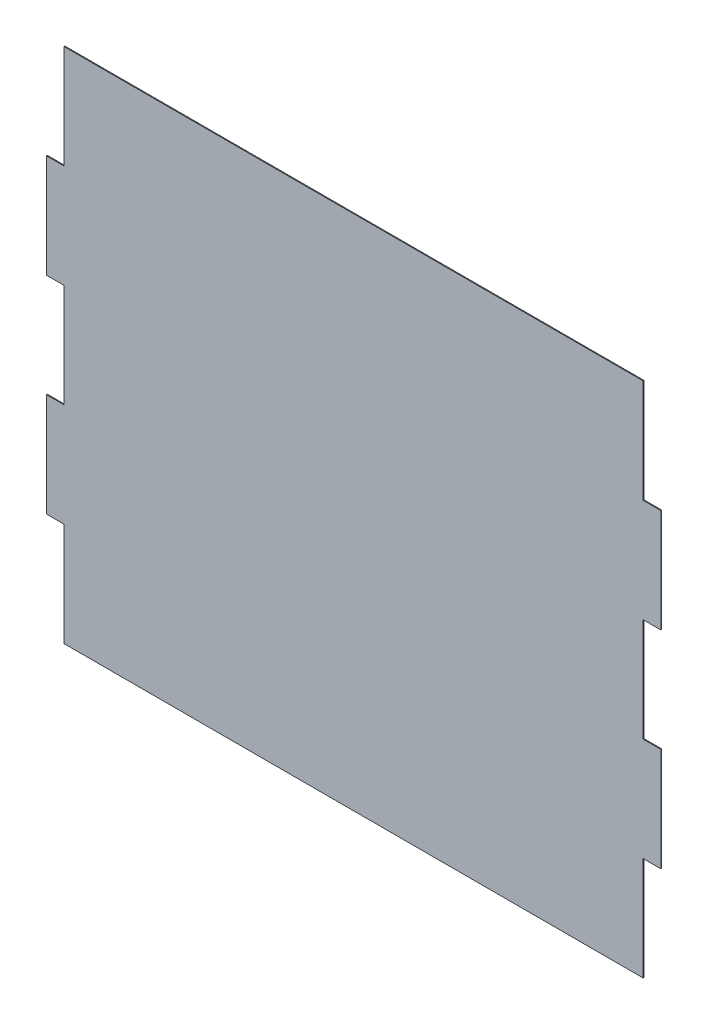
ISO-10303-21;
HEADER;
FILE_DESCRIPTION(('STEP AP214'),'2;1');
FILE_NAME('part.step','',(''),(''),'','','');
FILE_SCHEMA(('AUTOMOTIVE_DESIGN { 1 0 10303 214 1 1 1 1 }'));
ENDSEC;
DATA;
#1=APPLICATION_CONTEXT('core data for automotive mechanical design processes');
#2=APPLICATION_PROTOCOL_DEFINITION('international standard','automotive_design',2000,#1);
#3=PRODUCT_CONTEXT('',#1,'mechanical');
#4=PRODUCT('Part','Part','',(#3));
#5=PRODUCT_RELATED_PRODUCT_CATEGORY('part','',(#4));
#6=PRODUCT_DEFINITION_FORMATION('','',#4);
#7=PRODUCT_DEFINITION_CONTEXT('part definition',#1,'design');
#8=PRODUCT_DEFINITION('design','',#6,#7);
#9=PRODUCT_DEFINITION_SHAPE('','',#8);
#10=(LENGTH_UNIT() NAMED_UNIT(*) SI_UNIT(.MILLI.,.METRE.));
#11=(NAMED_UNIT(*) PLANE_ANGLE_UNIT() SI_UNIT($,.RADIAN.));
#12=(NAMED_UNIT(*) SI_UNIT($,.STERADIAN.) SOLID_ANGLE_UNIT());
#13=UNCERTAINTY_MEASURE_WITH_UNIT(LENGTH_MEASURE(1.E-05),#10,'distance_accuracy_value','');
#14=(GEOMETRIC_REPRESENTATION_CONTEXT(3) GLOBAL_UNCERTAINTY_ASSIGNED_CONTEXT((#13)) GLOBAL_UNIT_ASSIGNED_CONTEXT((#10,
#11,#12)) REPRESENTATION_CONTEXT('',''));
#15=CARTESIAN_POINT('',(0.,0.,0.));
#16=DIRECTION('',(0.,0.,1.));
#17=DIRECTION('',(1.,0.,0.));
#18=AXIS2_PLACEMENT_3D('',#15,#16,#17);
#19=CARTESIAN_POINT('',(84.,45.,0.125));
#20=DIRECTION('',(-1.,0.,0.));
#21=DIRECTION('',(0.,0.,1.));
#22=AXIS2_PLACEMENT_3D('',#19,#20,#21);
#23=PLANE('',#22);
#24=DIRECTION('',(0.,1.,0.));
#25=VECTOR('',#24,1.);
#26=CARTESIAN_POINT('',(84.,45.,-0.125));
#27=LINE('',#26,#25);
#28=CARTESIAN_POINT('',(84.,45.,-0.125));
#29=VERTEX_POINT('',#28);
#30=CARTESIAN_POINT('',(84.,75.,-0.125));
#31=VERTEX_POINT('',#30);
#32=EDGE_CURVE('E201',#29,#31,#27,.T.);
#33=ORIENTED_EDGE('',*,*,#32,.T.);
#34=DIRECTION('',(0.,0.,-1.));
#35=VECTOR('',#34,1.);
#36=CARTESIAN_POINT('',(84.,75.,0.125));
#37=LINE('',#36,#35);
#38=CARTESIAN_POINT('',(84.,75.,0.125));
#39=VERTEX_POINT('',#38);
#40=EDGE_CURVE('E11',#39,#31,#37,.T.);
#41=ORIENTED_EDGE('',*,*,#40,.F.);
#42=DIRECTION('',(0.,1.,0.));
#43=VECTOR('',#42,1.);
#44=CARTESIAN_POINT('',(84.,45.,0.125));
#45=LINE('',#44,#43);
#46=CARTESIAN_POINT('',(84.,45.,0.125));
#47=VERTEX_POINT('',#46);
#48=EDGE_CURVE('E252',#47,#39,#45,.T.);
#49=ORIENTED_EDGE('',*,*,#48,.F.);
#50=DIRECTION('',(0.,0.,-1.));
#51=VECTOR('',#50,1.);
#52=CARTESIAN_POINT('',(84.,45.,0.125));
#53=LINE('',#52,#51);
#54=EDGE_CURVE('E49',#47,#29,#53,.T.);
#55=ORIENTED_EDGE('',*,*,#54,.T.);
#56=EDGE_LOOP('',(#33,#41,#49,#55));
#57=FACE_BOUND('',#56,.T.);
#58=ADVANCED_FACE('F33',(#57),#23,.F.);
#59=CARTESIAN_POINT('',(84.,75.,0.125));
#60=DIRECTION('',(0.,-1.,0.));
#61=DIRECTION('',(0.,0.,-1.));
#62=AXIS2_PLACEMENT_3D('',#59,#60,#61);
#63=PLANE('',#62);
#64=DIRECTION('',(-1.,0.,0.));
#65=VECTOR('',#64,1.);
#66=CARTESIAN_POINT('',(84.,75.,-0.125));
#67=LINE('',#66,#65);
#68=CARTESIAN_POINT('',(-84.,75.,-0.125));
#69=VERTEX_POINT('',#68);
#70=EDGE_CURVE('E203',#31,#69,#67,.T.);
#71=ORIENTED_EDGE('',*,*,#70,.T.);
#72=DIRECTION('',(0.,0.,-1.));
#73=VECTOR('',#72,1.);
#74=CARTESIAN_POINT('',(-84.,75.,0.125));
#75=LINE('',#74,#73);
#76=CARTESIAN_POINT('',(-84.,75.,0.125));
#77=VERTEX_POINT('',#76);
#78=EDGE_CURVE('E41',#77,#69,#75,.T.);
#79=ORIENTED_EDGE('',*,*,#78,.F.);
#80=DIRECTION('',(-1.,0.,0.));
#81=VECTOR('',#80,1.);
#82=CARTESIAN_POINT('',(84.,75.,0.125));
#83=LINE('',#82,#81);
#84=EDGE_CURVE('E123',#39,#77,#83,.T.);
#85=ORIENTED_EDGE('',*,*,#84,.F.);
#86=ORIENTED_EDGE('',*,*,#40,.T.);
#87=EDGE_LOOP('',(#71,#79,#85,#86));
#88=FACE_BOUND('',#87,.T.);
#89=ADVANCED_FACE('F294',(#88),#63,.F.);
#90=CARTESIAN_POINT('',(-84.,45.,0.125));
#91=DIRECTION('',(-1.,0.,0.));
#92=DIRECTION('',(0.,0.,1.));
#93=AXIS2_PLACEMENT_3D('',#90,#91,#92);
#94=PLANE('',#93);
#95=DIRECTION('',(0.,1.,0.));
#96=VECTOR('',#95,1.);
#97=CARTESIAN_POINT('',(-84.,45.,-0.125));
#98=LINE('',#97,#96);
#99=CARTESIAN_POINT('',(-84.,45.,-0.125));
#100=VERTEX_POINT('',#99);
#101=EDGE_CURVE('E206',#100,#69,#98,.T.);
#102=ORIENTED_EDGE('',*,*,#101,.F.);
#103=DIRECTION('',(0.,0.,-1.));
#104=VECTOR('',#103,1.);
#105=CARTESIAN_POINT('',(-84.,45.,0.125));
#106=LINE('',#105,#104);
#107=CARTESIAN_POINT('',(-84.,45.,0.125));
#108=VERTEX_POINT('',#107);
#109=EDGE_CURVE('E287',#108,#100,#106,.T.);
#110=ORIENTED_EDGE('',*,*,#109,.F.);
#111=DIRECTION('',(0.,1.,0.));
#112=VECTOR('',#111,1.);
#113=CARTESIAN_POINT('',(-84.,45.,0.125));
#114=LINE('',#113,#112);
#115=EDGE_CURVE('E293',#108,#77,#114,.T.);
#116=ORIENTED_EDGE('',*,*,#115,.T.);
#117=ORIENTED_EDGE('',*,*,#78,.T.);
#118=EDGE_LOOP('',(#102,#110,#116,#117));
#119=FACE_BOUND('',#118,.T.);
#120=ADVANCED_FACE('F291',(#119),#94,.T.);
#121=CARTESIAN_POINT('',(-84.,45.,0.125));
#122=DIRECTION('',(0.,-1.,0.));
#123=DIRECTION('',(0.,0.,-1.));
#124=AXIS2_PLACEMENT_3D('',#121,#122,#123);
#125=PLANE('',#124);
#126=DIRECTION('',(-1.,0.,0.));
#127=VECTOR('',#126,1.);
#128=CARTESIAN_POINT('',(-84.,45.,-0.125));
#129=LINE('',#128,#127);
#130=CARTESIAN_POINT('',(-89.1239442731817,45.,-0.125));
#131=VERTEX_POINT('',#130);
#132=EDGE_CURVE('E209',#100,#131,#129,.T.);
#133=ORIENTED_EDGE('',*,*,#132,.T.);
#134=DIRECTION('',(0.,0.,-1.));
#135=VECTOR('',#134,1.);
#136=CARTESIAN_POINT('',(-89.1239442731817,45.,0.125));
#137=LINE('',#136,#135);
#138=CARTESIAN_POINT('',(-89.1239442731817,45.,0.125));
#139=VERTEX_POINT('',#138);
#140=EDGE_CURVE('E284',#139,#131,#137,.T.);
#141=ORIENTED_EDGE('',*,*,#140,.F.);
#142=DIRECTION('',(-1.,0.,0.));
#143=VECTOR('',#142,1.);
#144=CARTESIAN_POINT('',(-84.,45.,0.125));
#145=LINE('',#144,#143);
#146=EDGE_CURVE('E312',#108,#139,#145,.T.);
#147=ORIENTED_EDGE('',*,*,#146,.F.);
#148=ORIENTED_EDGE('',*,*,#109,.T.);
#149=EDGE_LOOP('',(#133,#141,#147,#148));
#150=FACE_BOUND('',#149,.T.);
#151=ADVANCED_FACE('F303',(#150),#125,.F.);
#152=CARTESIAN_POINT('',(-89.1239442731817,45.,0.125));
#153=DIRECTION('',(1.,0.,0.));
#154=DIRECTION('',(0.,0.,-1.));
#155=AXIS2_PLACEMENT_3D('',#152,#153,#154);
#156=PLANE('',#155);
#157=DIRECTION('',(0.,-1.,0.));
#158=VECTOR('',#157,1.);
#159=CARTESIAN_POINT('',(-89.1239442731817,45.,-0.125));
#160=LINE('',#159,#158);
#161=CARTESIAN_POINT('',(-89.1239442731817,15.,-0.125));
#162=VERTEX_POINT('',#161);
#163=EDGE_CURVE('E211',#131,#162,#160,.T.);
#164=ORIENTED_EDGE('',*,*,#163,.T.);
#165=DIRECTION('',(0.,0.,-1.));
#166=VECTOR('',#165,1.);
#167=CARTESIAN_POINT('',(-89.1239442731817,15.,0.125));
#168=LINE('',#167,#166);
#169=CARTESIAN_POINT('',(-89.1239442731817,15.,0.125));
#170=VERTEX_POINT('',#169);
#171=EDGE_CURVE('E281',#170,#162,#168,.T.);
#172=ORIENTED_EDGE('',*,*,#171,.F.);
#173=DIRECTION('',(0.,-1.,0.));
#174=VECTOR('',#173,1.);
#175=CARTESIAN_POINT('',(-89.1239442731817,45.,0.125));
#176=LINE('',#175,#174);
#177=EDGE_CURVE('E309',#139,#170,#176,.T.);
#178=ORIENTED_EDGE('',*,*,#177,.F.);
#179=ORIENTED_EDGE('',*,*,#140,.T.);
#180=EDGE_LOOP('',(#164,#172,#178,#179));
#181=FACE_BOUND('',#180,.T.);
#182=ADVANCED_FACE('F307',(#181),#156,.F.);
#183=CARTESIAN_POINT('',(-89.1239442731817,15.,0.125));
#184=DIRECTION('',(0.,1.,0.));
#185=DIRECTION('',(0.,0.,1.));
#186=AXIS2_PLACEMENT_3D('',#183,#184,#185);
#187=PLANE('',#186);
#188=DIRECTION('',(1.,0.,0.));
#189=VECTOR('',#188,1.);
#190=CARTESIAN_POINT('',(-89.1239442731817,15.,-0.125));
#191=LINE('',#190,#189);
#192=CARTESIAN_POINT('',(-84.,15.,-0.125));
#193=VERTEX_POINT('',#192);
#194=EDGE_CURVE('E213',#162,#193,#191,.T.);
#195=ORIENTED_EDGE('',*,*,#194,.T.);
#196=DIRECTION('',(0.,0.,-1.));
#197=VECTOR('',#196,1.);
#198=CARTESIAN_POINT('',(-84.,15.,0.125));
#199=LINE('',#198,#197);
#200=CARTESIAN_POINT('',(-84.,15.,0.125));
#201=VERTEX_POINT('',#200);
#202=EDGE_CURVE('E279',#201,#193,#199,.T.);
#203=ORIENTED_EDGE('',*,*,#202,.F.);
#204=DIRECTION('',(1.,0.,0.));
#205=VECTOR('',#204,1.);
#206=CARTESIAN_POINT('',(-89.1239442731817,15.,0.125));
#207=LINE('',#206,#205);
#208=EDGE_CURVE('E311',#170,#201,#207,.T.);
#209=ORIENTED_EDGE('',*,*,#208,.F.);
#210=ORIENTED_EDGE('',*,*,#171,.T.);
#211=EDGE_LOOP('',(#195,#203,#209,#210));
#212=FACE_BOUND('',#211,.T.);
#213=ADVANCED_FACE('F378',(#212),#187,.F.);
#214=CARTESIAN_POINT('',(-84.,-15.,0.125));
#215=DIRECTION('',(-1.,0.,0.));
#216=DIRECTION('',(0.,0.,1.));
#217=AXIS2_PLACEMENT_3D('',#214,#215,#216);
#218=PLANE('',#217);
#219=DIRECTION('',(0.,1.,0.));
#220=VECTOR('',#219,1.);
#221=CARTESIAN_POINT('',(-84.,-15.,-0.125));
#222=LINE('',#221,#220);
#223=CARTESIAN_POINT('',(-84.,-15.,-0.125));
#224=VERTEX_POINT('',#223);
#225=EDGE_CURVE('E216',#224,#193,#222,.T.);
#226=ORIENTED_EDGE('',*,*,#225,.F.);
#227=DIRECTION('',(0.,0.,-1.));
#228=VECTOR('',#227,1.);
#229=CARTESIAN_POINT('',(-84.,-15.,0.125));
#230=LINE('',#229,#228);
#231=CARTESIAN_POINT('',(-84.,-15.,0.125));
#232=VERTEX_POINT('',#231);
#233=EDGE_CURVE('E277',#232,#224,#230,.T.);
#234=ORIENTED_EDGE('',*,*,#233,.F.);
#235=DIRECTION('',(0.,1.,0.));
#236=VECTOR('',#235,1.);
#237=CARTESIAN_POINT('',(-84.,-15.,0.125));
#238=LINE('',#237,#236);
#239=EDGE_CURVE('E314',#232,#201,#238,.T.);
#240=ORIENTED_EDGE('',*,*,#239,.T.);
#241=ORIENTED_EDGE('',*,*,#202,.T.);
#242=EDGE_LOOP('',(#226,#234,#240,#241));
#243=FACE_BOUND('',#242,.T.);
#244=ADVANCED_FACE('F381',(#243),#218,.T.);
#245=CARTESIAN_POINT('',(-89.1239442731817,-15.,0.125));
#246=DIRECTION('',(0.,1.,0.));
#247=DIRECTION('',(0.,0.,1.));
#248=AXIS2_PLACEMENT_3D('',#245,#246,#247);
#249=PLANE('',#248);
#250=DIRECTION('',(1.,0.,0.));
#251=VECTOR('',#250,1.);
#252=CARTESIAN_POINT('',(-89.1239442731817,-15.,-0.125));
#253=LINE('',#252,#251);
#254=CARTESIAN_POINT('',(-89.1239442731817,-15.,-0.125));
#255=VERTEX_POINT('',#254);
#256=EDGE_CURVE('E219',#255,#224,#253,.T.);
#257=ORIENTED_EDGE('',*,*,#256,.F.);
#258=DIRECTION('',(0.,0.,-1.));
#259=VECTOR('',#258,1.);
#260=CARTESIAN_POINT('',(-89.1239442731817,-15.,0.125));
#261=LINE('',#260,#259);
#262=CARTESIAN_POINT('',(-89.1239442731817,-15.,0.125));
#263=VERTEX_POINT('',#262);
#264=EDGE_CURVE('E275',#263,#255,#261,.T.);
#265=ORIENTED_EDGE('',*,*,#264,.F.);
#266=DIRECTION('',(1.,0.,0.));
#267=VECTOR('',#266,1.);
#268=CARTESIAN_POINT('',(-89.1239442731817,-15.,0.125));
#269=LINE('',#268,#267);
#270=EDGE_CURVE('E321',#263,#232,#269,.T.);
#271=ORIENTED_EDGE('',*,*,#270,.T.);
#272=ORIENTED_EDGE('',*,*,#233,.T.);
#273=EDGE_LOOP('',(#257,#265,#271,#272));
#274=FACE_BOUND('',#273,.T.);
#275=ADVANCED_FACE('F385',(#274),#249,.T.);
#276=CARTESIAN_POINT('',(-89.1239442731817,-45.,0.125));
#277=DIRECTION('',(-1.,0.,0.));
#278=DIRECTION('',(0.,0.,1.));
#279=AXIS2_PLACEMENT_3D('',#276,#277,#278);
#280=PLANE('',#279);
#281=DIRECTION('',(0.,1.,0.));
#282=VECTOR('',#281,1.);
#283=CARTESIAN_POINT('',(-89.1239442731817,-45.,-0.125));
#284=LINE('',#283,#282);
#285=CARTESIAN_POINT('',(-89.1239442731817,-45.,-0.125));
#286=VERTEX_POINT('',#285);
#287=EDGE_CURVE('E222',#286,#255,#284,.T.);
#288=ORIENTED_EDGE('',*,*,#287,.F.);
#289=DIRECTION('',(0.,0.,-1.));
#290=VECTOR('',#289,1.);
#291=CARTESIAN_POINT('',(-89.1239442731817,-45.,0.125));
#292=LINE('',#291,#290);
#293=CARTESIAN_POINT('',(-89.1239442731817,-45.,0.125));
#294=VERTEX_POINT('',#293);
#295=EDGE_CURVE('E273',#294,#286,#292,.T.);
#296=ORIENTED_EDGE('',*,*,#295,.F.);
#297=DIRECTION('',(0.,1.,0.));
#298=VECTOR('',#297,1.);
#299=CARTESIAN_POINT('',(-89.1239442731817,-45.,0.125));
#300=LINE('',#299,#298);
#301=EDGE_CURVE('E324',#294,#263,#300,.T.);
#302=ORIENTED_EDGE('',*,*,#301,.T.);
#303=ORIENTED_EDGE('',*,*,#264,.T.);
#304=EDGE_LOOP('',(#288,#296,#302,#303));
#305=FACE_BOUND('',#304,.T.);
#306=ADVANCED_FACE('F389',(#305),#280,.T.);
#307=CARTESIAN_POINT('',(-84.,-45.,0.125));
#308=DIRECTION('',(0.,-1.,0.));
#309=DIRECTION('',(0.,0.,-1.));
#310=AXIS2_PLACEMENT_3D('',#307,#308,#309);
#311=PLANE('',#310);
#312=DIRECTION('',(-1.,0.,0.));
#313=VECTOR('',#312,1.);
#314=CARTESIAN_POINT('',(-84.,-45.,-0.125));
#315=LINE('',#314,#313);
#316=CARTESIAN_POINT('',(-84.,-45.,-0.125));
#317=VERTEX_POINT('',#316);
#318=EDGE_CURVE('E225',#317,#286,#315,.T.);
#319=ORIENTED_EDGE('',*,*,#318,.F.);
#320=DIRECTION('',(0.,0.,-1.));
#321=VECTOR('',#320,1.);
#322=CARTESIAN_POINT('',(-84.,-45.,0.125));
#323=LINE('',#322,#321);
#324=CARTESIAN_POINT('',(-84.,-45.,0.125));
#325=VERTEX_POINT('',#324);
#326=EDGE_CURVE('E271',#325,#317,#323,.T.);
#327=ORIENTED_EDGE('',*,*,#326,.F.);
#328=DIRECTION('',(-1.,0.,0.));
#329=VECTOR('',#328,1.);
#330=CARTESIAN_POINT('',(-84.,-45.,0.125));
#331=LINE('',#330,#329);
#332=EDGE_CURVE('E327',#325,#294,#331,.T.);
#333=ORIENTED_EDGE('',*,*,#332,.T.);
#334=ORIENTED_EDGE('',*,*,#295,.T.);
#335=EDGE_LOOP('',(#319,#327,#333,#334));
#336=FACE_BOUND('',#335,.T.);
#337=ADVANCED_FACE('F393',(#336),#311,.T.);
#338=CARTESIAN_POINT('',(-84.,-45.,0.125));
#339=DIRECTION('',(1.,0.,0.));
#340=DIRECTION('',(0.,0.,-1.));
#341=AXIS2_PLACEMENT_3D('',#338,#339,#340);
#342=PLANE('',#341);
#343=DIRECTION('',(0.,-1.,0.));
#344=VECTOR('',#343,1.);
#345=CARTESIAN_POINT('',(-84.,-45.,-0.125));
#346=LINE('',#345,#344);
#347=CARTESIAN_POINT('',(-84.,-75.,-0.125));
#348=VERTEX_POINT('',#347);
#349=EDGE_CURVE('E228',#317,#348,#346,.T.);
#350=ORIENTED_EDGE('',*,*,#349,.T.);
#351=DIRECTION('',(0.,0.,-1.));
#352=VECTOR('',#351,1.);
#353=CARTESIAN_POINT('',(-84.,-75.,0.125));
#354=LINE('',#353,#352);
#355=CARTESIAN_POINT('',(-84.,-75.,0.125));
#356=VERTEX_POINT('',#355);
#357=EDGE_CURVE('E269',#356,#348,#354,.T.);
#358=ORIENTED_EDGE('',*,*,#357,.F.);
#359=DIRECTION('',(0.,-1.,0.));
#360=VECTOR('',#359,1.);
#361=CARTESIAN_POINT('',(-84.,-45.,0.125));
#362=LINE('',#361,#360);
#363=EDGE_CURVE('E330',#325,#356,#362,.T.);
#364=ORIENTED_EDGE('',*,*,#363,.F.);
#365=ORIENTED_EDGE('',*,*,#326,.T.);
#366=EDGE_LOOP('',(#350,#358,#364,#365));
#367=FACE_BOUND('',#366,.T.);
#368=ADVANCED_FACE('F397',(#367),#342,.F.);
#369=CARTESIAN_POINT('',(84.,-75.,0.125));
#370=DIRECTION('',(0.,-1.,0.));
#371=DIRECTION('',(0.,0.,-1.));
#372=AXIS2_PLACEMENT_3D('',#369,#370,#371);
#373=PLANE('',#372);
#374=DIRECTION('',(-1.,0.,0.));
#375=VECTOR('',#374,1.);
#376=CARTESIAN_POINT('',(84.,-75.,-0.125));
#377=LINE('',#376,#375);
#378=CARTESIAN_POINT('',(84.,-75.,-0.125));
#379=VERTEX_POINT('',#378);
#380=EDGE_CURVE('E231',#379,#348,#377,.T.);
#381=ORIENTED_EDGE('',*,*,#380,.F.);
#382=DIRECTION('',(0.,0.,-1.));
#383=VECTOR('',#382,1.);
#384=CARTESIAN_POINT('',(84.,-75.,0.125));
#385=LINE('',#384,#383);
#386=CARTESIAN_POINT('',(84.,-75.,0.125));
#387=VERTEX_POINT('',#386);
#388=EDGE_CURVE('E267',#387,#379,#385,.T.);
#389=ORIENTED_EDGE('',*,*,#388,.F.);
#390=DIRECTION('',(-1.,0.,0.));
#391=VECTOR('',#390,1.);
#392=CARTESIAN_POINT('',(84.,-75.,0.125));
#393=LINE('',#392,#391);
#394=EDGE_CURVE('E332',#387,#356,#393,.T.);
#395=ORIENTED_EDGE('',*,*,#394,.T.);
#396=ORIENTED_EDGE('',*,*,#357,.T.);
#397=EDGE_LOOP('',(#381,#389,#395,#396));
#398=FACE_BOUND('',#397,.T.);
#399=ADVANCED_FACE('F401',(#398),#373,.T.);
#400=CARTESIAN_POINT('',(84.,-45.,0.125));
#401=DIRECTION('',(1.,0.,0.));
#402=DIRECTION('',(0.,0.,-1.));
#403=AXIS2_PLACEMENT_3D('',#400,#401,#402);
#404=PLANE('',#403);
#405=DIRECTION('',(0.,-1.,0.));
#406=VECTOR('',#405,1.);
#407=CARTESIAN_POINT('',(84.,-45.,-0.125));
#408=LINE('',#407,#406);
#409=CARTESIAN_POINT('',(84.,-45.,-0.125));
#410=VERTEX_POINT('',#409);
#411=EDGE_CURVE('E234',#410,#379,#408,.T.);
#412=ORIENTED_EDGE('',*,*,#411,.F.);
#413=DIRECTION('',(0.,0.,-1.));
#414=VECTOR('',#413,1.);
#415=CARTESIAN_POINT('',(84.,-45.,0.125));
#416=LINE('',#415,#414);
#417=CARTESIAN_POINT('',(84.,-45.,0.125));
#418=VERTEX_POINT('',#417);
#419=EDGE_CURVE('E265',#418,#410,#416,.T.);
#420=ORIENTED_EDGE('',*,*,#419,.F.);
#421=DIRECTION('',(0.,-1.,0.));
#422=VECTOR('',#421,1.);
#423=CARTESIAN_POINT('',(84.,-45.,0.125));
#424=LINE('',#423,#422);
#425=EDGE_CURVE('E335',#418,#387,#424,.T.);
#426=ORIENTED_EDGE('',*,*,#425,.T.);
#427=ORIENTED_EDGE('',*,*,#388,.T.);
#428=EDGE_LOOP('',(#412,#420,#426,#427));
#429=FACE_BOUND('',#428,.T.);
#430=ADVANCED_FACE('F405',(#429),#404,.T.);
#431=CARTESIAN_POINT('',(84.,-45.,0.125));
#432=DIRECTION('',(0.,1.,0.));
#433=DIRECTION('',(0.,0.,1.));
#434=AXIS2_PLACEMENT_3D('',#431,#432,#433);
#435=PLANE('',#434);
#436=DIRECTION('',(1.,0.,0.));
#437=VECTOR('',#436,1.);
#438=CARTESIAN_POINT('',(84.,-45.,-0.125));
#439=LINE('',#438,#437);
#440=CARTESIAN_POINT('',(89.1239442731817,-45.,-0.125));
#441=VERTEX_POINT('',#440);
#442=EDGE_CURVE('E237',#410,#441,#439,.T.);
#443=ORIENTED_EDGE('',*,*,#442,.T.);
#444=DIRECTION('',(0.,0.,-1.));
#445=VECTOR('',#444,1.);
#446=CARTESIAN_POINT('',(89.1239442731817,-45.,0.125));
#447=LINE('',#446,#445);
#448=CARTESIAN_POINT('',(89.1239442731817,-45.,0.125));
#449=VERTEX_POINT('',#448);
#450=EDGE_CURVE('E262',#449,#441,#447,.T.);
#451=ORIENTED_EDGE('',*,*,#450,.F.);
#452=DIRECTION('',(1.,0.,0.));
#453=VECTOR('',#452,1.);
#454=CARTESIAN_POINT('',(84.,-45.,0.125));
#455=LINE('',#454,#453);
#456=EDGE_CURVE('E338',#418,#449,#455,.T.);
#457=ORIENTED_EDGE('',*,*,#456,.F.);
#458=ORIENTED_EDGE('',*,*,#419,.T.);
#459=EDGE_LOOP('',(#443,#451,#457,#458));
#460=FACE_BOUND('',#459,.T.);
#461=ADVANCED_FACE('F409',(#460),#435,.F.);
#462=CARTESIAN_POINT('',(89.1239442731817,-45.,0.125));
#463=DIRECTION('',(-1.,0.,0.));
#464=DIRECTION('',(0.,0.,1.));
#465=AXIS2_PLACEMENT_3D('',#462,#463,#464);
#466=PLANE('',#465);
#467=DIRECTION('',(0.,1.,0.));
#468=VECTOR('',#467,1.);
#469=CARTESIAN_POINT('',(89.1239442731817,-45.,-0.125));
#470=LINE('',#469,#468);
#471=CARTESIAN_POINT('',(89.1239442731817,-15.,-0.125));
#472=VERTEX_POINT('',#471);
#473=EDGE_CURVE('E239',#441,#472,#470,.T.);
#474=ORIENTED_EDGE('',*,*,#473,.T.);
#475=DIRECTION('',(0.,0.,-1.));
#476=VECTOR('',#475,1.);
#477=CARTESIAN_POINT('',(89.1239442731817,-15.,0.125));
#478=LINE('',#477,#476);
#479=CARTESIAN_POINT('',(89.1239442731817,-15.,0.125));
#480=VERTEX_POINT('',#479);
#481=EDGE_CURVE('E259',#480,#472,#478,.T.);
#482=ORIENTED_EDGE('',*,*,#481,.F.);
#483=DIRECTION('',(0.,1.,0.));
#484=VECTOR('',#483,1.);
#485=CARTESIAN_POINT('',(89.1239442731817,-45.,0.125));
#486=LINE('',#485,#484);
#487=EDGE_CURVE('E340',#449,#480,#486,.T.);
#488=ORIENTED_EDGE('',*,*,#487,.F.);
#489=ORIENTED_EDGE('',*,*,#450,.T.);
#490=EDGE_LOOP('',(#474,#482,#488,#489));
#491=FACE_BOUND('',#490,.T.);
#492=ADVANCED_FACE('F413',(#491),#466,.F.);
#493=CARTESIAN_POINT('',(89.1239442731817,-15.,0.125));
#494=DIRECTION('',(0.,-1.,0.));
#495=DIRECTION('',(0.,0.,-1.));
#496=AXIS2_PLACEMENT_3D('',#493,#494,#495);
#497=PLANE('',#496);
#498=DIRECTION('',(-1.,0.,0.));
#499=VECTOR('',#498,1.);
#500=CARTESIAN_POINT('',(89.1239442731817,-15.,-0.125));
#501=LINE('',#500,#499);
#502=CARTESIAN_POINT('',(84.,-15.,-0.125));
#503=VERTEX_POINT('',#502);
#504=EDGE_CURVE('E241',#472,#503,#501,.T.);
#505=ORIENTED_EDGE('',*,*,#504,.T.);
#506=DIRECTION('',(0.,0.,-1.));
#507=VECTOR('',#506,1.);
#508=CARTESIAN_POINT('',(84.,-15.,0.125));
#509=LINE('',#508,#507);
#510=CARTESIAN_POINT('',(84.,-15.,0.125));
#511=VERTEX_POINT('',#510);
#512=EDGE_CURVE('E256',#511,#503,#509,.T.);
#513=ORIENTED_EDGE('',*,*,#512,.F.);
#514=DIRECTION('',(-1.,0.,0.));
#515=VECTOR('',#514,1.);
#516=CARTESIAN_POINT('',(89.1239442731817,-15.,0.125));
#517=LINE('',#516,#515);
#518=EDGE_CURVE('E342',#480,#511,#517,.T.);
#519=ORIENTED_EDGE('',*,*,#518,.F.);
#520=ORIENTED_EDGE('',*,*,#481,.T.);
#521=EDGE_LOOP('',(#505,#513,#519,#520));
#522=FACE_BOUND('',#521,.T.);
#523=ADVANCED_FACE('F348',(#522),#497,.F.);
#524=CARTESIAN_POINT('',(84.,-15.,0.125));
#525=DIRECTION('',(-1.,0.,0.));
#526=DIRECTION('',(0.,0.,1.));
#527=AXIS2_PLACEMENT_3D('',#524,#525,#526);
#528=PLANE('',#527);
#529=DIRECTION('',(0.,1.,0.));
#530=VECTOR('',#529,1.);
#531=CARTESIAN_POINT('',(84.,-15.,-0.125));
#532=LINE('',#531,#530);
#533=CARTESIAN_POINT('',(84.,15.,-0.125));
#534=VERTEX_POINT('',#533);
#535=EDGE_CURVE('E243',#503,#534,#532,.T.);
#536=ORIENTED_EDGE('',*,*,#535,.T.);
#537=DIRECTION('',(0.,0.,-1.));
#538=VECTOR('',#537,1.);
#539=CARTESIAN_POINT('',(84.,15.,0.125));
#540=LINE('',#539,#538);
#541=CARTESIAN_POINT('',(84.,15.,0.125));
#542=VERTEX_POINT('',#541);
#543=EDGE_CURVE('E184',#542,#534,#540,.T.);
#544=ORIENTED_EDGE('',*,*,#543,.F.);
#545=DIRECTION('',(0.,1.,0.));
#546=VECTOR('',#545,1.);
#547=CARTESIAN_POINT('',(84.,-15.,0.125));
#548=LINE('',#547,#546);
#549=EDGE_CURVE('E192',#511,#542,#548,.T.);
#550=ORIENTED_EDGE('',*,*,#549,.F.);
#551=ORIENTED_EDGE('',*,*,#512,.T.);
#552=EDGE_LOOP('',(#536,#544,#550,#551));
#553=FACE_BOUND('',#552,.T.);
#554=ADVANCED_FACE('F352',(#553),#528,.F.);
#555=CARTESIAN_POINT('',(89.1239442731817,15.,0.125));
#556=DIRECTION('',(0.,-1.,0.));
#557=DIRECTION('',(0.,0.,-1.));
#558=AXIS2_PLACEMENT_3D('',#555,#556,#557);
#559=PLANE('',#558);
#560=DIRECTION('',(-1.,0.,0.));
#561=VECTOR('',#560,1.);
#562=CARTESIAN_POINT('',(89.1239442731817,15.,-0.125));
#563=LINE('',#562,#561);
#564=CARTESIAN_POINT('',(89.1239442731817,15.,-0.125));
#565=VERTEX_POINT('',#564);
#566=EDGE_CURVE('E180',#565,#534,#563,.T.);
#567=ORIENTED_EDGE('',*,*,#566,.F.);
#568=DIRECTION('',(0.,0.,-1.));
#569=VECTOR('',#568,1.);
#570=CARTESIAN_POINT('',(89.1239442731817,15.,0.125));
#571=LINE('',#570,#569);
#572=CARTESIAN_POINT('',(89.1239442731817,15.,0.125));
#573=VERTEX_POINT('',#572);
#574=EDGE_CURVE('E175',#573,#565,#571,.T.);
#575=ORIENTED_EDGE('',*,*,#574,.F.);
#576=DIRECTION('',(-1.,0.,0.));
#577=VECTOR('',#576,1.);
#578=CARTESIAN_POINT('',(89.1239442731817,15.,0.125));
#579=LINE('',#578,#577);
#580=EDGE_CURVE('E178',#573,#542,#579,.T.);
#581=ORIENTED_EDGE('',*,*,#580,.T.);
#582=ORIENTED_EDGE('',*,*,#543,.T.);
#583=EDGE_LOOP('',(#567,#575,#581,#582));
#584=FACE_BOUND('',#583,.T.);
#585=ADVANCED_FACE('F177',(#584),#559,.T.);
#586=CARTESIAN_POINT('',(89.1239442731817,45.,0.125));
#587=DIRECTION('',(1.,0.,0.));
#588=DIRECTION('',(0.,0.,-1.));
#589=AXIS2_PLACEMENT_3D('',#586,#587,#588);
#590=PLANE('',#589);
#591=DIRECTION('',(0.,-1.,0.));
#592=VECTOR('',#591,1.);
#593=CARTESIAN_POINT('',(89.1239442731817,45.,-0.125));
#594=LINE('',#593,#592);
#595=CARTESIAN_POINT('',(89.1239442731817,45.,-0.125));
#596=VERTEX_POINT('',#595);
#597=EDGE_CURVE('E247',#596,#565,#594,.T.);
#598=ORIENTED_EDGE('',*,*,#597,.F.);
#599=DIRECTION('',(0.,0.,-1.));
#600=VECTOR('',#599,1.);
#601=CARTESIAN_POINT('',(89.1239442731817,45.,0.125));
#602=LINE('',#601,#600);
#603=CARTESIAN_POINT('',(89.1239442731817,45.,0.125));
#604=VERTEX_POINT('',#603);
#605=EDGE_CURVE('E111',#604,#596,#602,.T.);
#606=ORIENTED_EDGE('',*,*,#605,.F.);
#607=DIRECTION('',(0.,-1.,0.));
#608=VECTOR('',#607,1.);
#609=CARTESIAN_POINT('',(89.1239442731817,45.,0.125));
#610=LINE('',#609,#608);
#611=EDGE_CURVE('E190',#604,#573,#610,.T.);
#612=ORIENTED_EDGE('',*,*,#611,.T.);
#613=ORIENTED_EDGE('',*,*,#574,.T.);
#614=EDGE_LOOP('',(#598,#606,#612,#613));
#615=FACE_BOUND('',#614,.T.);
#616=ADVANCED_FACE('F195',(#615),#590,.T.);
#617=CARTESIAN_POINT('',(84.,45.,0.125));
#618=DIRECTION('',(0.,1.,0.));
#619=DIRECTION('',(0.,0.,1.));
#620=AXIS2_PLACEMENT_3D('',#617,#618,#619);
#621=PLANE('',#620);
#622=DIRECTION('',(1.,0.,0.));
#623=VECTOR('',#622,1.);
#624=CARTESIAN_POINT('',(84.,45.,-0.125));
#625=LINE('',#624,#623);
#626=EDGE_CURVE('E249',#29,#596,#625,.T.);
#627=ORIENTED_EDGE('',*,*,#626,.F.);
#628=ORIENTED_EDGE('',*,*,#54,.F.);
#629=DIRECTION('',(1.,0.,0.));
#630=VECTOR('',#629,1.);
#631=CARTESIAN_POINT('',(84.,45.,0.125));
#632=LINE('',#631,#630);
#633=EDGE_CURVE('E196',#47,#604,#632,.T.);
#634=ORIENTED_EDGE('',*,*,#633,.T.);
#635=ORIENTED_EDGE('',*,*,#605,.T.);
#636=EDGE_LOOP('',(#627,#628,#634,#635));
#637=FACE_BOUND('',#636,.T.);
#638=ADVANCED_FACE('F353',(#637),#621,.T.);
#639=CARTESIAN_POINT('',(0.,0.,0.125));
#640=DIRECTION('',(0.,0.,1.));
#641=DIRECTION('',(1.,0.,0.));
#642=AXIS2_PLACEMENT_3D('',#639,#640,#641);
#643=PLANE('',#642);
#644=ORIENTED_EDGE('',*,*,#48,.T.);
#645=ORIENTED_EDGE('',*,*,#84,.T.);
#646=ORIENTED_EDGE('',*,*,#115,.F.);
#647=ORIENTED_EDGE('',*,*,#146,.T.);
#648=ORIENTED_EDGE('',*,*,#177,.T.);
#649=ORIENTED_EDGE('',*,*,#208,.T.);
#650=ORIENTED_EDGE('',*,*,#239,.F.);
#651=ORIENTED_EDGE('',*,*,#270,.F.);
#652=ORIENTED_EDGE('',*,*,#301,.F.);
#653=ORIENTED_EDGE('',*,*,#332,.F.);
#654=ORIENTED_EDGE('',*,*,#363,.T.);
#655=ORIENTED_EDGE('',*,*,#394,.F.);
#656=ORIENTED_EDGE('',*,*,#425,.F.);
#657=ORIENTED_EDGE('',*,*,#456,.T.);
#658=ORIENTED_EDGE('',*,*,#487,.T.);
#659=ORIENTED_EDGE('',*,*,#518,.T.);
#660=ORIENTED_EDGE('',*,*,#549,.T.);
#661=ORIENTED_EDGE('',*,*,#580,.F.);
#662=ORIENTED_EDGE('',*,*,#611,.F.);
#663=ORIENTED_EDGE('',*,*,#633,.F.);
#664=EDGE_LOOP('',(#644,#645,#646,#647,#648,#649,#650,#651,#652,#653,#654,#655,#656,#657,#658,
#659,#660,#661,#662,#663));
#665=FACE_BOUND('',#664,.T.);
#666=ADVANCED_FACE('F188',(#665),#643,.T.);
#667=CARTESIAN_POINT('',(0.,0.,-0.125));
#668=DIRECTION('',(0.,0.,1.));
#669=DIRECTION('',(1.,0.,0.));
#670=AXIS2_PLACEMENT_3D('',#667,#668,#669);
#671=PLANE('',#670);
#672=ORIENTED_EDGE('',*,*,#32,.F.);
#673=ORIENTED_EDGE('',*,*,#626,.T.);
#674=ORIENTED_EDGE('',*,*,#597,.T.);
#675=ORIENTED_EDGE('',*,*,#566,.T.);
#676=ORIENTED_EDGE('',*,*,#535,.F.);
#677=ORIENTED_EDGE('',*,*,#504,.F.);
#678=ORIENTED_EDGE('',*,*,#473,.F.);
#679=ORIENTED_EDGE('',*,*,#442,.F.);
#680=ORIENTED_EDGE('',*,*,#411,.T.);
#681=ORIENTED_EDGE('',*,*,#380,.T.);
#682=ORIENTED_EDGE('',*,*,#349,.F.);
#683=ORIENTED_EDGE('',*,*,#318,.T.);
#684=ORIENTED_EDGE('',*,*,#287,.T.);
#685=ORIENTED_EDGE('',*,*,#256,.T.);
#686=ORIENTED_EDGE('',*,*,#225,.T.);
#687=ORIENTED_EDGE('',*,*,#194,.F.);
#688=ORIENTED_EDGE('',*,*,#163,.F.);
#689=ORIENTED_EDGE('',*,*,#132,.F.);
#690=ORIENTED_EDGE('',*,*,#101,.T.);
#691=ORIENTED_EDGE('',*,*,#70,.F.);
#692=EDGE_LOOP('',(#672,#673,#674,#675,#676,#677,#678,#679,#680,#681,#682,#683,#684,#685,#686,
#687,#688,#689,#690,#691));
#693=FACE_BOUND('',#692,.T.);
#694=ADVANCED_FACE('F298',(#693),#671,.F.);
#695=CLOSED_SHELL('',(#58,#89,#120,#151,#182,#213,#244,#275,#306,#337,#368,#399,#430,#461,#492,
#523,#554,#585,#616,#638,#666,#694));
#696=MANIFOLD_SOLID_BREP('B2',#695);
#697=ADVANCED_BREP_SHAPE_REPRESENTATION('',(#18,#696),#14);
#698=SHAPE_DEFINITION_REPRESENTATION(#9,#697);
ENDSEC;
END-ISO-10303-21;
